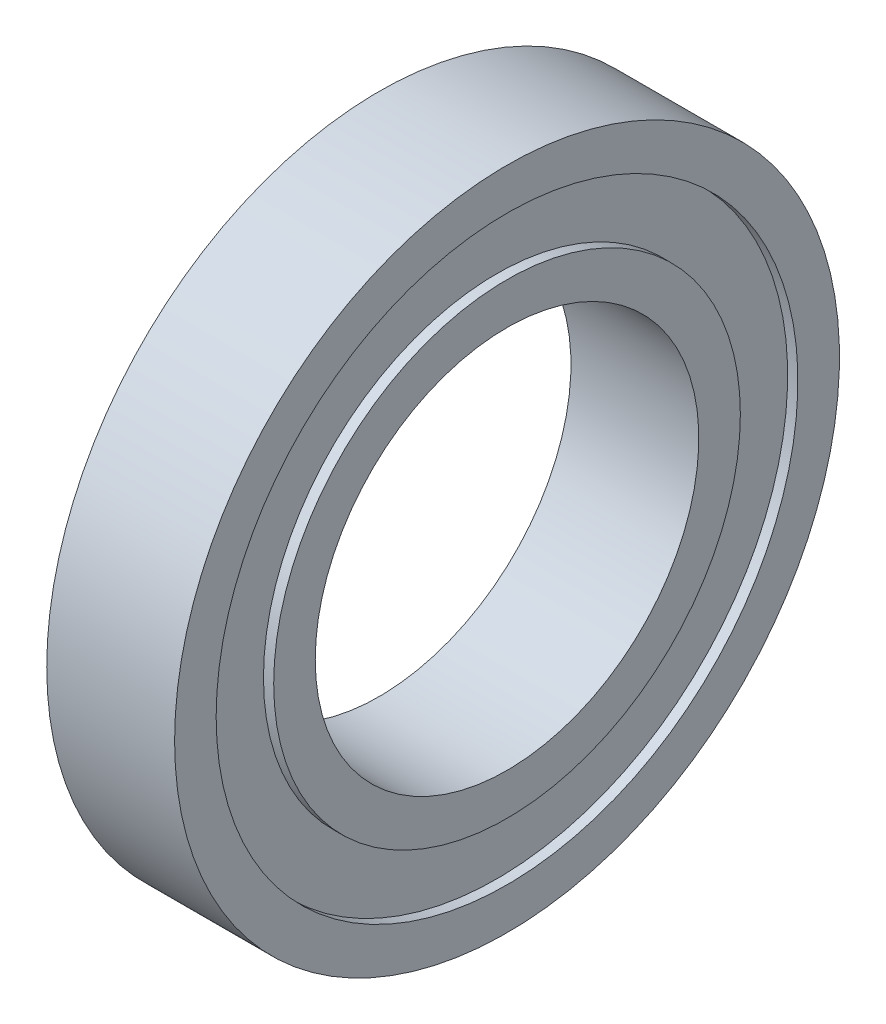
ISO-10303-21;
HEADER;
FILE_DESCRIPTION(('STEP AP214'),'2;1');
FILE_NAME('part.step','',(''),(''),'','','');
FILE_SCHEMA(('AUTOMOTIVE_DESIGN { 1 0 10303 214 1 1 1 1 }'));
ENDSEC;
DATA;
#1=APPLICATION_CONTEXT('core data for automotive mechanical design processes');
#2=APPLICATION_PROTOCOL_DEFINITION('international standard','automotive_design',2000,#1);
#3=PRODUCT_CONTEXT('',#1,'mechanical');
#4=PRODUCT('Part','Part','',(#3));
#5=PRODUCT_RELATED_PRODUCT_CATEGORY('part','',(#4));
#6=PRODUCT_DEFINITION_FORMATION('','',#4);
#7=PRODUCT_DEFINITION_CONTEXT('part definition',#1,'design');
#8=PRODUCT_DEFINITION('design','',#6,#7);
#9=PRODUCT_DEFINITION_SHAPE('','',#8);
#10=(LENGTH_UNIT() NAMED_UNIT(*) SI_UNIT(.MILLI.,.METRE.));
#11=(NAMED_UNIT(*) PLANE_ANGLE_UNIT() SI_UNIT($,.RADIAN.));
#12=(NAMED_UNIT(*) SI_UNIT($,.STERADIAN.) SOLID_ANGLE_UNIT());
#13=UNCERTAINTY_MEASURE_WITH_UNIT(LENGTH_MEASURE(1.E-05),#10,'distance_accuracy_value','');
#14=(GEOMETRIC_REPRESENTATION_CONTEXT(3) GLOBAL_UNCERTAINTY_ASSIGNED_CONTEXT((#13)) GLOBAL_UNIT_ASSIGNED_CONTEXT((#10,
#11,#12)) REPRESENTATION_CONTEXT('',''));
#15=CARTESIAN_POINT('',(0.,0.,0.));
#16=DIRECTION('',(0.,0.,1.));
#17=DIRECTION('',(1.,0.,0.));
#18=AXIS2_PLACEMENT_3D('',#15,#16,#17);
#19=CARTESIAN_POINT('',(0.,0.,0.));
#20=DIRECTION('',(-1.,0.,0.));
#21=DIRECTION('',(0.,0.,1.));
#22=AXIS2_PLACEMENT_3D('',#19,#20,#21);
#23=CYLINDRICAL_SURFACE('',#22,7.5);
#24=CARTESIAN_POINT('',(5.,0.,0.));
#25=DIRECTION('',(-1.,0.,0.));
#26=DIRECTION('',(0.,0.,1.));
#27=AXIS2_PLACEMENT_3D('',#24,#25,#26);
#28=CIRCLE('',#27,7.5);
#29=CARTESIAN_POINT('',(5.,0.,7.5));
#30=VERTEX_POINT('',#29);
#31=EDGE_CURVE('E96',#30,#30,#28,.T.);
#32=ORIENTED_EDGE('',*,*,#31,.F.);
#33=EDGE_LOOP('',(#32));
#34=FACE_BOUND('',#33,.T.);
#35=CARTESIAN_POINT('',(0.,0.,0.));
#36=DIRECTION('',(-1.,0.,0.));
#37=DIRECTION('',(0.,0.,1.));
#38=AXIS2_PLACEMENT_3D('',#35,#36,#37);
#39=CIRCLE('',#38,7.5);
#40=CARTESIAN_POINT('',(0.,0.,7.5));
#41=VERTEX_POINT('',#40);
#42=EDGE_CURVE('E10',#41,#41,#39,.T.);
#43=ORIENTED_EDGE('',*,*,#42,.T.);
#44=EDGE_LOOP('',(#43));
#45=FACE_BOUND('',#44,.T.);
#46=ADVANCED_FACE('F45',(#34,#45),#23,.F.);
#47=CARTESIAN_POINT('',(0.,0.,-7.5));
#48=DIRECTION('',(1.,0.,0.));
#49=DIRECTION('',(0.,0.,-1.));
#50=AXIS2_PLACEMENT_3D('',#47,#48,#49);
#51=PLANE('',#50);
#52=ORIENTED_EDGE('',*,*,#42,.F.);
#53=EDGE_LOOP('',(#52));
#54=FACE_BOUND('',#53,.T.);
#55=CARTESIAN_POINT('',(0.,0.,0.));
#56=DIRECTION('',(-1.,0.,0.));
#57=DIRECTION('',(0.,0.,1.));
#58=AXIS2_PLACEMENT_3D('',#55,#56,#57);
#59=CIRCLE('',#58,9.125);
#60=CARTESIAN_POINT('',(0.,0.,9.125));
#61=VERTEX_POINT('',#60);
#62=EDGE_CURVE('E52',#61,#61,#59,.T.);
#63=ORIENTED_EDGE('',*,*,#62,.T.);
#64=EDGE_LOOP('',(#63));
#65=FACE_BOUND('',#64,.T.);
#66=ADVANCED_FACE('F104',(#54,#65),#51,.F.);
#67=CARTESIAN_POINT('',(0.,0.,0.));
#68=DIRECTION('',(-1.,0.,0.));
#69=DIRECTION('',(0.,0.,1.));
#70=AXIS2_PLACEMENT_3D('',#67,#68,#69);
#71=CYLINDRICAL_SURFACE('',#70,9.125);
#72=ORIENTED_EDGE('',*,*,#62,.F.);
#73=EDGE_LOOP('',(#72));
#74=FACE_BOUND('',#73,.T.);
#75=CARTESIAN_POINT('',(0.4,0.,0.));
#76=DIRECTION('',(-1.,0.,0.));
#77=DIRECTION('',(0.,0.,1.));
#78=AXIS2_PLACEMENT_3D('',#75,#76,#77);
#79=CIRCLE('',#78,9.125);
#80=CARTESIAN_POINT('',(0.4,0.,9.125));
#81=VERTEX_POINT('',#80);
#82=EDGE_CURVE('E59',#81,#81,#79,.T.);
#83=ORIENTED_EDGE('',*,*,#82,.T.);
#84=EDGE_LOOP('',(#83));
#85=FACE_BOUND('',#84,.T.);
#86=ADVANCED_FACE('F107',(#74,#85),#71,.T.);
#87=CARTESIAN_POINT('',(0.4,0.,-9.125));
#88=DIRECTION('',(1.,0.,0.));
#89=DIRECTION('',(0.,0.,-1.));
#90=AXIS2_PLACEMENT_3D('',#87,#88,#89);
#91=PLANE('',#90);
#92=ORIENTED_EDGE('',*,*,#82,.F.);
#93=EDGE_LOOP('',(#92));
#94=FACE_BOUND('',#93,.T.);
#95=CARTESIAN_POINT('',(0.399999999999999,0.,0.));
#96=DIRECTION('',(-1.,0.,0.));
#97=DIRECTION('',(0.,0.,1.));
#98=AXIS2_PLACEMENT_3D('',#95,#96,#97);
#99=CIRCLE('',#98,11.375);
#100=CARTESIAN_POINT('',(0.399999999999999,0.,11.375));
#101=VERTEX_POINT('',#100);
#102=EDGE_CURVE('E65',#101,#101,#99,.T.);
#103=ORIENTED_EDGE('',*,*,#102,.T.);
#104=EDGE_LOOP('',(#103));
#105=FACE_BOUND('',#104,.T.);
#106=ADVANCED_FACE('F111',(#94,#105),#91,.F.);
#107=CARTESIAN_POINT('',(0.,0.,0.));
#108=DIRECTION('',(-1.,0.,0.));
#109=DIRECTION('',(0.,0.,1.));
#110=AXIS2_PLACEMENT_3D('',#107,#108,#109);
#111=CYLINDRICAL_SURFACE('',#110,11.375);
#112=ORIENTED_EDGE('',*,*,#102,.F.);
#113=EDGE_LOOP('',(#112));
#114=FACE_BOUND('',#113,.T.);
#115=CARTESIAN_POINT('',(0.,0.,0.));
#116=DIRECTION('',(-1.,0.,0.));
#117=DIRECTION('',(0.,0.,1.));
#118=AXIS2_PLACEMENT_3D('',#115,#116,#117);
#119=CIRCLE('',#118,11.375);
#120=CARTESIAN_POINT('',(0.,0.,11.375));
#121=VERTEX_POINT('',#120);
#122=EDGE_CURVE('E71',#121,#121,#119,.T.);
#123=ORIENTED_EDGE('',*,*,#122,.T.);
#124=EDGE_LOOP('',(#123));
#125=FACE_BOUND('',#124,.T.);
#126=ADVANCED_FACE('F117',(#114,#125),#111,.F.);
#127=CARTESIAN_POINT('',(0.,0.,-11.375));
#128=DIRECTION('',(1.,0.,0.));
#129=DIRECTION('',(0.,0.,-1.));
#130=AXIS2_PLACEMENT_3D('',#127,#128,#129);
#131=PLANE('',#130);
#132=ORIENTED_EDGE('',*,*,#122,.F.);
#133=EDGE_LOOP('',(#132));
#134=FACE_BOUND('',#133,.T.);
#135=CARTESIAN_POINT('',(0.,0.,0.));
#136=DIRECTION('',(-1.,0.,0.));
#137=DIRECTION('',(0.,0.,1.));
#138=AXIS2_PLACEMENT_3D('',#135,#136,#137);
#139=CIRCLE('',#138,13.);
#140=CARTESIAN_POINT('',(0.,0.,13.));
#141=VERTEX_POINT('',#140);
#142=EDGE_CURVE('E75',#141,#141,#139,.T.);
#143=ORIENTED_EDGE('',*,*,#142,.T.);
#144=EDGE_LOOP('',(#143));
#145=FACE_BOUND('',#144,.T.);
#146=ADVANCED_FACE('F121',(#134,#145),#131,.F.);
#147=CARTESIAN_POINT('',(0.,0.,0.));
#148=DIRECTION('',(-1.,0.,0.));
#149=DIRECTION('',(0.,0.,1.));
#150=AXIS2_PLACEMENT_3D('',#147,#148,#149);
#151=CYLINDRICAL_SURFACE('',#150,13.);
#152=ORIENTED_EDGE('',*,*,#142,.F.);
#153=EDGE_LOOP('',(#152));
#154=FACE_BOUND('',#153,.T.);
#155=CARTESIAN_POINT('',(5.,0.,0.));
#156=DIRECTION('',(-1.,0.,0.));
#157=DIRECTION('',(0.,0.,1.));
#158=AXIS2_PLACEMENT_3D('',#155,#156,#157);
#159=CIRCLE('',#158,13.);
#160=CARTESIAN_POINT('',(5.,0.,13.));
#161=VERTEX_POINT('',#160);
#162=EDGE_CURVE('E78',#161,#161,#159,.T.);
#163=ORIENTED_EDGE('',*,*,#162,.T.);
#164=EDGE_LOOP('',(#163));
#165=FACE_BOUND('',#164,.T.);
#166=ADVANCED_FACE('F125',(#154,#165),#151,.T.);
#167=CARTESIAN_POINT('',(5.,0.,-13.));
#168=DIRECTION('',(-1.,0.,0.));
#169=DIRECTION('',(0.,0.,1.));
#170=AXIS2_PLACEMENT_3D('',#167,#168,#169);
#171=PLANE('',#170);
#172=ORIENTED_EDGE('',*,*,#162,.F.);
#173=EDGE_LOOP('',(#172));
#174=FACE_BOUND('',#173,.T.);
#175=CARTESIAN_POINT('',(5.,0.,0.));
#176=DIRECTION('',(-1.,0.,0.));
#177=DIRECTION('',(0.,0.,1.));
#178=AXIS2_PLACEMENT_3D('',#175,#176,#177);
#179=CIRCLE('',#178,11.375);
#180=CARTESIAN_POINT('',(5.,0.,11.375));
#181=VERTEX_POINT('',#180);
#182=EDGE_CURVE('E82',#181,#181,#179,.T.);
#183=ORIENTED_EDGE('',*,*,#182,.T.);
#184=EDGE_LOOP('',(#183));
#185=FACE_BOUND('',#184,.T.);
#186=ADVANCED_FACE('F129',(#174,#185),#171,.F.);
#187=CARTESIAN_POINT('',(0.,0.,0.));
#188=DIRECTION('',(-1.,0.,0.));
#189=DIRECTION('',(0.,0.,1.));
#190=AXIS2_PLACEMENT_3D('',#187,#188,#189);
#191=CYLINDRICAL_SURFACE('',#190,11.375);
#192=ORIENTED_EDGE('',*,*,#182,.F.);
#193=EDGE_LOOP('',(#192));
#194=FACE_BOUND('',#193,.T.);
#195=CARTESIAN_POINT('',(4.6,0.,0.));
#196=DIRECTION('',(-1.,0.,0.));
#197=DIRECTION('',(0.,0.,1.));
#198=AXIS2_PLACEMENT_3D('',#195,#196,#197);
#199=CIRCLE('',#198,11.375);
#200=CARTESIAN_POINT('',(4.6,0.,11.375));
#201=VERTEX_POINT('',#200);
#202=EDGE_CURVE('E85',#201,#201,#199,.T.);
#203=ORIENTED_EDGE('',*,*,#202,.T.);
#204=EDGE_LOOP('',(#203));
#205=FACE_BOUND('',#204,.T.);
#206=ADVANCED_FACE('F133',(#194,#205),#191,.F.);
#207=CARTESIAN_POINT('',(4.6,0.,-11.375));
#208=DIRECTION('',(-1.,0.,0.));
#209=DIRECTION('',(0.,0.,1.));
#210=AXIS2_PLACEMENT_3D('',#207,#208,#209);
#211=PLANE('',#210);
#212=ORIENTED_EDGE('',*,*,#202,.F.);
#213=EDGE_LOOP('',(#212));
#214=FACE_BOUND('',#213,.T.);
#215=CARTESIAN_POINT('',(4.6,0.,0.));
#216=DIRECTION('',(-1.,0.,0.));
#217=DIRECTION('',(0.,0.,1.));
#218=AXIS2_PLACEMENT_3D('',#215,#216,#217);
#219=CIRCLE('',#218,9.125);
#220=CARTESIAN_POINT('',(4.6,0.,9.125));
#221=VERTEX_POINT('',#220);
#222=EDGE_CURVE('E89',#221,#221,#219,.T.);
#223=ORIENTED_EDGE('',*,*,#222,.T.);
#224=EDGE_LOOP('',(#223));
#225=FACE_BOUND('',#224,.T.);
#226=ADVANCED_FACE('F137',(#214,#225),#211,.F.);
#227=CARTESIAN_POINT('',(0.,0.,0.));
#228=DIRECTION('',(-1.,0.,0.));
#229=DIRECTION('',(0.,0.,1.));
#230=AXIS2_PLACEMENT_3D('',#227,#228,#229);
#231=CYLINDRICAL_SURFACE('',#230,9.125);
#232=ORIENTED_EDGE('',*,*,#222,.F.);
#233=EDGE_LOOP('',(#232));
#234=FACE_BOUND('',#233,.T.);
#235=CARTESIAN_POINT('',(5.,0.,0.));
#236=DIRECTION('',(-1.,0.,0.));
#237=DIRECTION('',(0.,0.,1.));
#238=AXIS2_PLACEMENT_3D('',#235,#236,#237);
#239=CIRCLE('',#238,9.125);
#240=CARTESIAN_POINT('',(5.,0.,9.125));
#241=VERTEX_POINT('',#240);
#242=EDGE_CURVE('E92',#241,#241,#239,.T.);
#243=ORIENTED_EDGE('',*,*,#242,.T.);
#244=EDGE_LOOP('',(#243));
#245=FACE_BOUND('',#244,.T.);
#246=ADVANCED_FACE('F141',(#234,#245),#231,.T.);
#247=CARTESIAN_POINT('',(5.,0.,-9.125));
#248=DIRECTION('',(-1.,0.,0.));
#249=DIRECTION('',(0.,0.,1.));
#250=AXIS2_PLACEMENT_3D('',#247,#248,#249);
#251=PLANE('',#250);
#252=ORIENTED_EDGE('',*,*,#242,.F.);
#253=EDGE_LOOP('',(#252));
#254=FACE_BOUND('',#253,.T.);
#255=ORIENTED_EDGE('',*,*,#31,.T.);
#256=EDGE_LOOP('',(#255));
#257=FACE_BOUND('',#256,.T.);
#258=ADVANCED_FACE('F101',(#254,#257),#251,.F.);
#259=CLOSED_SHELL('',(#46,#66,#86,#106,#126,#146,#166,#186,#206,#226,#246,#258));
#260=MANIFOLD_SOLID_BREP('B2',#259);
#261=ADVANCED_BREP_SHAPE_REPRESENTATION('',(#18,#260),#14);
#262=SHAPE_DEFINITION_REPRESENTATION(#9,#261);
ENDSEC;
END-ISO-10303-21;
